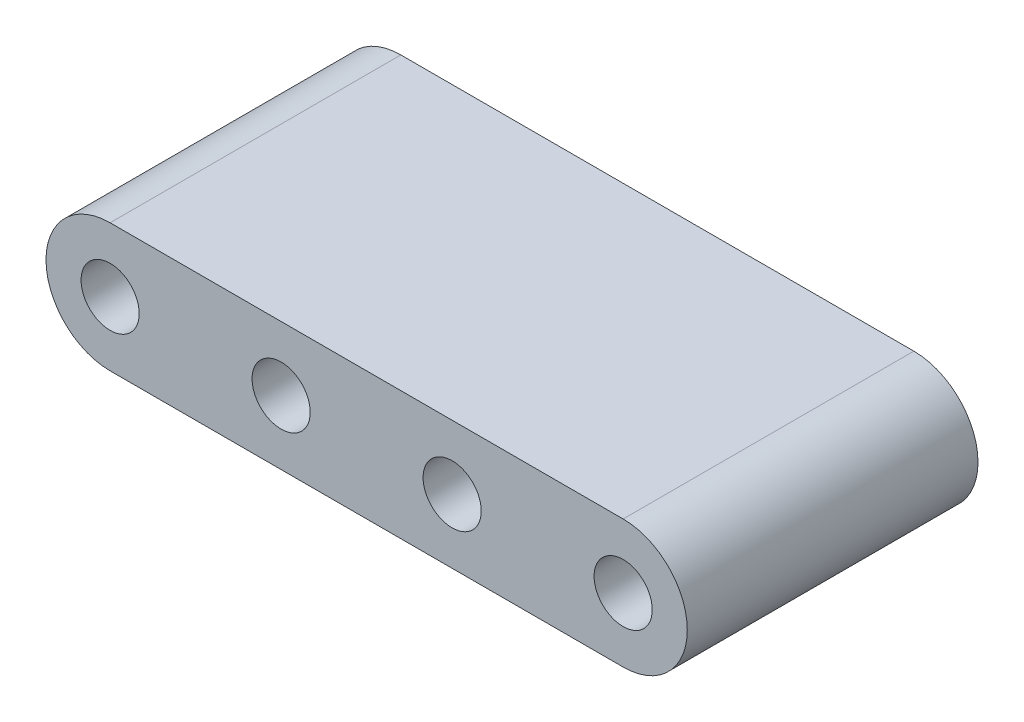
ISO-10303-21;
HEADER;
FILE_DESCRIPTION(('STEP AP214'),'2;1');
FILE_NAME('part.step','',(''),(''),'','','');
FILE_SCHEMA(('AUTOMOTIVE_DESIGN { 1 0 10303 214 1 1 1 1 }'));
ENDSEC;
DATA;
#1=APPLICATION_CONTEXT('core data for automotive mechanical design processes');
#2=APPLICATION_PROTOCOL_DEFINITION('international standard','automotive_design',2000,#1);
#3=PRODUCT_CONTEXT('',#1,'mechanical');
#4=PRODUCT('Part','Part','',(#3));
#5=PRODUCT_RELATED_PRODUCT_CATEGORY('part','',(#4));
#6=PRODUCT_DEFINITION_FORMATION('','',#4);
#7=PRODUCT_DEFINITION_CONTEXT('part definition',#1,'design');
#8=PRODUCT_DEFINITION('design','',#6,#7);
#9=PRODUCT_DEFINITION_SHAPE('','',#8);
#10=(LENGTH_UNIT() NAMED_UNIT(*) SI_UNIT(.MILLI.,.METRE.));
#11=(NAMED_UNIT(*) PLANE_ANGLE_UNIT() SI_UNIT($,.RADIAN.));
#12=(NAMED_UNIT(*) SI_UNIT($,.STERADIAN.) SOLID_ANGLE_UNIT());
#13=UNCERTAINTY_MEASURE_WITH_UNIT(LENGTH_MEASURE(1.E-05),#10,'distance_accuracy_value','');
#14=(GEOMETRIC_REPRESENTATION_CONTEXT(3) GLOBAL_UNCERTAINTY_ASSIGNED_CONTEXT((#13)) GLOBAL_UNIT_ASSIGNED_CONTEXT((#10,
#11,#12)) REPRESENTATION_CONTEXT('',''));
#15=CARTESIAN_POINT('',(0.,0.,0.));
#16=DIRECTION('',(0.,0.,1.));
#17=DIRECTION('',(1.,0.,0.));
#18=AXIS2_PLACEMENT_3D('',#15,#16,#17);
#19=CARTESIAN_POINT('',(0.,0.,-34.));
#20=DIRECTION('',(0.,0.,-1.));
#21=DIRECTION('',(1.,0.,0.));
#22=AXIS2_PLACEMENT_3D('',#19,#20,#21);
#23=PLANE('',#22);
#24=CARTESIAN_POINT('',(40.,0.,-34.));
#25=DIRECTION('',(0.,0.,1.));
#26=DIRECTION('',(1.,0.,0.));
#27=AXIS2_PLACEMENT_3D('',#24,#25,#26);
#28=CIRCLE('',#27,3.4);
#29=CARTESIAN_POINT('',(43.4,0.,-34.));
#30=VERTEX_POINT('',#29);
#31=EDGE_CURVE('E147',#30,#30,#28,.T.);
#32=ORIENTED_EDGE('',*,*,#31,.T.);
#33=EDGE_LOOP('',(#32));
#34=FACE_BOUND('',#33,.T.);
#35=CARTESIAN_POINT('',(0.,0.,-34.));
#36=DIRECTION('',(0.,0.,1.));
#37=DIRECTION('',(1.,0.,0.));
#38=AXIS2_PLACEMENT_3D('',#35,#36,#37);
#39=CIRCLE('',#38,3.4);
#40=CARTESIAN_POINT('',(3.4,0.,-34.));
#41=VERTEX_POINT('',#40);
#42=EDGE_CURVE('E121',#41,#41,#39,.T.);
#43=ORIENTED_EDGE('',*,*,#42,.T.);
#44=EDGE_LOOP('',(#43));
#45=FACE_BOUND('',#44,.T.);
#46=CARTESIAN_POINT('',(0.,0.,-34.));
#47=DIRECTION('',(0.,0.,1.));
#48=DIRECTION('',(1.,0.,0.));
#49=AXIS2_PLACEMENT_3D('',#46,#47,#48);
#50=CIRCLE('',#49,7.5);
#51=CARTESIAN_POINT('',(0.,7.5,-34.));
#52=VERTEX_POINT('',#51);
#53=CARTESIAN_POINT('',(0.,-7.5,-34.));
#54=VERTEX_POINT('',#53);
#55=EDGE_CURVE('E106',#52,#54,#50,.T.);
#56=ORIENTED_EDGE('',*,*,#55,.F.);
#57=DIRECTION('',(-1.,0.,0.));
#58=VECTOR('',#57,1.);
#59=CARTESIAN_POINT('',(0.,7.5,-34.));
#60=LINE('',#59,#58);
#61=CARTESIAN_POINT('',(60.,7.5,-34.));
#62=VERTEX_POINT('',#61);
#63=EDGE_CURVE('E109',#62,#52,#60,.T.);
#64=ORIENTED_EDGE('',*,*,#63,.F.);
#65=CARTESIAN_POINT('',(60.,0.,-34.));
#66=DIRECTION('',(0.,0.,1.));
#67=DIRECTION('',(1.,0.,0.));
#68=AXIS2_PLACEMENT_3D('',#65,#66,#67);
#69=CIRCLE('',#68,7.5);
#70=CARTESIAN_POINT('',(60.,-7.5,-34.));
#71=VERTEX_POINT('',#70);
#72=EDGE_CURVE('E95',#71,#62,#69,.T.);
#73=ORIENTED_EDGE('',*,*,#72,.F.);
#74=DIRECTION('',(1.,0.,0.));
#75=VECTOR('',#74,1.);
#76=CARTESIAN_POINT('',(0.,-7.5,-34.));
#77=LINE('',#76,#75);
#78=EDGE_CURVE('E101',#54,#71,#77,.T.);
#79=ORIENTED_EDGE('',*,*,#78,.F.);
#80=EDGE_LOOP('',(#56,#64,#73,#79));
#81=FACE_BOUND('',#80,.T.);
#82=CARTESIAN_POINT('',(20.,0.,-34.));
#83=DIRECTION('',(0.,0.,1.));
#84=DIRECTION('',(1.,0.,0.));
#85=AXIS2_PLACEMENT_3D('',#82,#83,#84);
#86=CIRCLE('',#85,3.4);
#87=CARTESIAN_POINT('',(23.4,0.,-34.));
#88=VERTEX_POINT('',#87);
#89=EDGE_CURVE('E139',#88,#88,#86,.T.);
#90=ORIENTED_EDGE('',*,*,#89,.T.);
#91=EDGE_LOOP('',(#90));
#92=FACE_BOUND('',#91,.T.);
#93=CARTESIAN_POINT('',(60.,0.,-34.));
#94=DIRECTION('',(0.,0.,1.));
#95=DIRECTION('',(1.,0.,0.));
#96=AXIS2_PLACEMENT_3D('',#93,#94,#95);
#97=CIRCLE('',#96,3.4);
#98=CARTESIAN_POINT('',(63.4,0.,-34.));
#99=VERTEX_POINT('',#98);
#100=EDGE_CURVE('E155',#99,#99,#97,.T.);
#101=ORIENTED_EDGE('',*,*,#100,.T.);
#102=EDGE_LOOP('',(#101));
#103=FACE_BOUND('',#102,.T.);
#104=ADVANCED_FACE('F47',(#34,#45,#81,#92,#103),#23,.T.);
#105=CARTESIAN_POINT('',(0.,0.,0.));
#106=DIRECTION('',(0.,0.,-1.));
#107=DIRECTION('',(1.,0.,0.));
#108=AXIS2_PLACEMENT_3D('',#105,#106,#107);
#109=PLANE('',#108);
#110=CARTESIAN_POINT('',(0.,0.,0.));
#111=DIRECTION('',(0.,0.,1.));
#112=DIRECTION('',(1.,0.,0.));
#113=AXIS2_PLACEMENT_3D('',#110,#111,#112);
#114=CIRCLE('',#113,7.5);
#115=CARTESIAN_POINT('',(0.,7.5,0.));
#116=VERTEX_POINT('',#115);
#117=CARTESIAN_POINT('',(0.,-7.5,0.));
#118=VERTEX_POINT('',#117);
#119=EDGE_CURVE('E116',#116,#118,#114,.T.);
#120=ORIENTED_EDGE('',*,*,#119,.T.);
#121=DIRECTION('',(1.,0.,0.));
#122=VECTOR('',#121,1.);
#123=CARTESIAN_POINT('',(0.,-7.5,0.));
#124=LINE('',#123,#122);
#125=CARTESIAN_POINT('',(60.,-7.5,0.));
#126=VERTEX_POINT('',#125);
#127=EDGE_CURVE('E120',#118,#126,#124,.T.);
#128=ORIENTED_EDGE('',*,*,#127,.T.);
#129=CARTESIAN_POINT('',(60.,0.,0.));
#130=DIRECTION('',(0.,0.,1.));
#131=DIRECTION('',(1.,0.,0.));
#132=AXIS2_PLACEMENT_3D('',#129,#130,#131);
#133=CIRCLE('',#132,7.5);
#134=CARTESIAN_POINT('',(60.,7.5,0.));
#135=VERTEX_POINT('',#134);
#136=EDGE_CURVE('E98',#126,#135,#133,.T.);
#137=ORIENTED_EDGE('',*,*,#136,.T.);
#138=DIRECTION('',(-1.,0.,0.));
#139=VECTOR('',#138,1.);
#140=CARTESIAN_POINT('',(0.,7.5,0.));
#141=LINE('',#140,#139);
#142=EDGE_CURVE('E126',#135,#116,#141,.T.);
#143=ORIENTED_EDGE('',*,*,#142,.T.);
#144=EDGE_LOOP('',(#120,#128,#137,#143));
#145=FACE_BOUND('',#144,.T.);
#146=CARTESIAN_POINT('',(0.,0.,0.));
#147=DIRECTION('',(0.,0.,1.));
#148=DIRECTION('',(1.,0.,0.));
#149=AXIS2_PLACEMENT_3D('',#146,#147,#148);
#150=CIRCLE('',#149,3.4);
#151=CARTESIAN_POINT('',(3.4,0.,0.));
#152=VERTEX_POINT('',#151);
#153=EDGE_CURVE('E135',#152,#152,#150,.T.);
#154=ORIENTED_EDGE('',*,*,#153,.F.);
#155=EDGE_LOOP('',(#154));
#156=FACE_BOUND('',#155,.T.);
#157=CARTESIAN_POINT('',(20.,0.,0.));
#158=DIRECTION('',(0.,0.,1.));
#159=DIRECTION('',(1.,0.,0.));
#160=AXIS2_PLACEMENT_3D('',#157,#158,#159);
#161=CIRCLE('',#160,3.4);
#162=CARTESIAN_POINT('',(23.4,0.,0.));
#163=VERTEX_POINT('',#162);
#164=EDGE_CURVE('E143',#163,#163,#161,.T.);
#165=ORIENTED_EDGE('',*,*,#164,.F.);
#166=EDGE_LOOP('',(#165));
#167=FACE_BOUND('',#166,.T.);
#168=CARTESIAN_POINT('',(40.,0.,0.));
#169=DIRECTION('',(0.,0.,1.));
#170=DIRECTION('',(1.,0.,0.));
#171=AXIS2_PLACEMENT_3D('',#168,#169,#170);
#172=CIRCLE('',#171,3.4);
#173=CARTESIAN_POINT('',(43.4,0.,0.));
#174=VERTEX_POINT('',#173);
#175=EDGE_CURVE('E151',#174,#174,#172,.T.);
#176=ORIENTED_EDGE('',*,*,#175,.F.);
#177=EDGE_LOOP('',(#176));
#178=FACE_BOUND('',#177,.T.);
#179=CARTESIAN_POINT('',(60.,0.,0.));
#180=DIRECTION('',(0.,0.,1.));
#181=DIRECTION('',(1.,0.,0.));
#182=AXIS2_PLACEMENT_3D('',#179,#180,#181);
#183=CIRCLE('',#182,3.4);
#184=CARTESIAN_POINT('',(63.4,0.,0.));
#185=VERTEX_POINT('',#184);
#186=EDGE_CURVE('E159',#185,#185,#183,.T.);
#187=ORIENTED_EDGE('',*,*,#186,.F.);
#188=EDGE_LOOP('',(#187));
#189=FACE_BOUND('',#188,.T.);
#190=ADVANCED_FACE('F175',(#145,#156,#167,#178,#189),#109,.F.);
#191=CARTESIAN_POINT('',(0.,0.,-34.));
#192=DIRECTION('',(0.,0.,1.));
#193=DIRECTION('',(-1.,0.,0.));
#194=AXIS2_PLACEMENT_3D('',#191,#192,#193);
#195=CYLINDRICAL_SURFACE('',#194,7.5);
#196=ORIENTED_EDGE('',*,*,#119,.F.);
#197=DIRECTION('',(0.,0.,1.));
#198=VECTOR('',#197,1.);
#199=CARTESIAN_POINT('',(0.,7.5,-34.));
#200=LINE('',#199,#198);
#201=EDGE_CURVE('E65',#52,#116,#200,.T.);
#202=ORIENTED_EDGE('',*,*,#201,.F.);
#203=ORIENTED_EDGE('',*,*,#55,.T.);
#204=DIRECTION('',(0.,0.,1.));
#205=VECTOR('',#204,1.);
#206=CARTESIAN_POINT('',(0.,-7.5,-34.));
#207=LINE('',#206,#205);
#208=EDGE_CURVE('E11',#54,#118,#207,.T.);
#209=ORIENTED_EDGE('',*,*,#208,.T.);
#210=EDGE_LOOP('',(#196,#202,#203,#209));
#211=FACE_BOUND('',#210,.T.);
#212=ADVANCED_FACE('F49',(#211),#195,.T.);
#213=CARTESIAN_POINT('',(0.,-7.5,-34.));
#214=DIRECTION('',(0.,1.,0.));
#215=DIRECTION('',(0.,0.,-1.));
#216=AXIS2_PLACEMENT_3D('',#213,#214,#215);
#217=PLANE('',#216);
#218=ORIENTED_EDGE('',*,*,#127,.F.);
#219=ORIENTED_EDGE('',*,*,#208,.F.);
#220=ORIENTED_EDGE('',*,*,#78,.T.);
#221=DIRECTION('',(0.,0.,1.));
#222=VECTOR('',#221,1.);
#223=CARTESIAN_POINT('',(60.,-7.5,-34.));
#224=LINE('',#223,#222);
#225=EDGE_CURVE('E57',#71,#126,#224,.T.);
#226=ORIENTED_EDGE('',*,*,#225,.T.);
#227=EDGE_LOOP('',(#218,#219,#220,#226));
#228=FACE_BOUND('',#227,.T.);
#229=ADVANCED_FACE('F102',(#228),#217,.F.);
#230=CARTESIAN_POINT('',(60.,0.,-34.));
#231=DIRECTION('',(0.,0.,1.));
#232=DIRECTION('',(-1.,0.,0.));
#233=AXIS2_PLACEMENT_3D('',#230,#231,#232);
#234=CYLINDRICAL_SURFACE('',#233,7.5);
#235=ORIENTED_EDGE('',*,*,#136,.F.);
#236=ORIENTED_EDGE('',*,*,#225,.F.);
#237=ORIENTED_EDGE('',*,*,#72,.T.);
#238=DIRECTION('',(0.,0.,1.));
#239=VECTOR('',#238,1.);
#240=CARTESIAN_POINT('',(60.,7.5,-34.));
#241=LINE('',#240,#239);
#242=EDGE_CURVE('E81',#62,#135,#241,.T.);
#243=ORIENTED_EDGE('',*,*,#242,.T.);
#244=EDGE_LOOP('',(#235,#236,#237,#243));
#245=FACE_BOUND('',#244,.T.);
#246=ADVANCED_FACE('F93',(#245),#234,.T.);
#247=CARTESIAN_POINT('',(0.,7.5,-34.));
#248=DIRECTION('',(0.,-1.,0.));
#249=DIRECTION('',(0.,0.,1.));
#250=AXIS2_PLACEMENT_3D('',#247,#248,#249);
#251=PLANE('',#250);
#252=ORIENTED_EDGE('',*,*,#142,.F.);
#253=ORIENTED_EDGE('',*,*,#242,.F.);
#254=ORIENTED_EDGE('',*,*,#63,.T.);
#255=ORIENTED_EDGE('',*,*,#201,.T.);
#256=EDGE_LOOP('',(#252,#253,#254,#255));
#257=FACE_BOUND('',#256,.T.);
#258=ADVANCED_FACE('F187',(#257),#251,.F.);
#259=CARTESIAN_POINT('',(0.,0.,-34.));
#260=DIRECTION('',(0.,0.,1.));
#261=DIRECTION('',(-1.,0.,0.));
#262=AXIS2_PLACEMENT_3D('',#259,#260,#261);
#263=CYLINDRICAL_SURFACE('',#262,3.4);
#264=ORIENTED_EDGE('',*,*,#42,.F.);
#265=EDGE_LOOP('',(#264));
#266=FACE_BOUND('',#265,.T.);
#267=ORIENTED_EDGE('',*,*,#153,.T.);
#268=EDGE_LOOP('',(#267));
#269=FACE_BOUND('',#268,.T.);
#270=ADVANCED_FACE('F190',(#266,#269),#263,.F.);
#271=CARTESIAN_POINT('',(20.,0.,-34.));
#272=DIRECTION('',(0.,0.,1.));
#273=DIRECTION('',(-1.,0.,0.));
#274=AXIS2_PLACEMENT_3D('',#271,#272,#273);
#275=CYLINDRICAL_SURFACE('',#274,3.4);
#276=ORIENTED_EDGE('',*,*,#89,.F.);
#277=EDGE_LOOP('',(#276));
#278=FACE_BOUND('',#277,.T.);
#279=ORIENTED_EDGE('',*,*,#164,.T.);
#280=EDGE_LOOP('',(#279));
#281=FACE_BOUND('',#280,.T.);
#282=ADVANCED_FACE('F214',(#278,#281),#275,.F.);
#283=CARTESIAN_POINT('',(40.,0.,-34.));
#284=DIRECTION('',(0.,0.,1.));
#285=DIRECTION('',(-1.,0.,0.));
#286=AXIS2_PLACEMENT_3D('',#283,#284,#285);
#287=CYLINDRICAL_SURFACE('',#286,3.4);
#288=ORIENTED_EDGE('',*,*,#31,.F.);
#289=EDGE_LOOP('',(#288));
#290=FACE_BOUND('',#289,.T.);
#291=ORIENTED_EDGE('',*,*,#175,.T.);
#292=EDGE_LOOP('',(#291));
#293=FACE_BOUND('',#292,.T.);
#294=ADVANCED_FACE('F171',(#290,#293),#287,.F.);
#295=CARTESIAN_POINT('',(60.,0.,-34.));
#296=DIRECTION('',(0.,0.,1.));
#297=DIRECTION('',(-1.,0.,0.));
#298=AXIS2_PLACEMENT_3D('',#295,#296,#297);
#299=CYLINDRICAL_SURFACE('',#298,3.4);
#300=ORIENTED_EDGE('',*,*,#100,.F.);
#301=EDGE_LOOP('',(#300));
#302=FACE_BOUND('',#301,.T.);
#303=ORIENTED_EDGE('',*,*,#186,.T.);
#304=EDGE_LOOP('',(#303));
#305=FACE_BOUND('',#304,.T.);
#306=ADVANCED_FACE('F168',(#302,#305),#299,.F.);
#307=CLOSED_SHELL('',(#104,#190,#212,#229,#246,#258,#270,#282,#294,#306));
#308=MANIFOLD_SOLID_BREP('B2',#307);
#309=ADVANCED_BREP_SHAPE_REPRESENTATION('',(#18,#308),#14);
#310=SHAPE_DEFINITION_REPRESENTATION(#9,#309);
ENDSEC;
END-ISO-10303-21;
